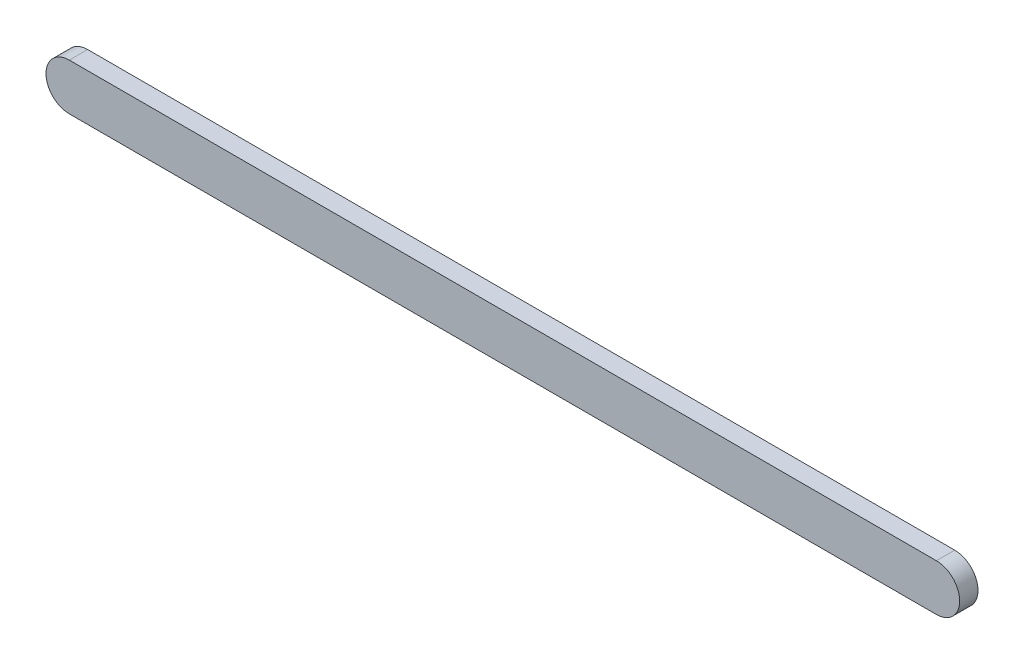
ISO-10303-21;
HEADER;
FILE_DESCRIPTION(('STEP AP214'),'2;1');
FILE_NAME('part.step','',(''),(''),'','','');
FILE_SCHEMA(('AUTOMOTIVE_DESIGN { 1 0 10303 214 1 1 1 1 }'));
ENDSEC;
DATA;
#1=APPLICATION_CONTEXT('core data for automotive mechanical design processes');
#2=APPLICATION_PROTOCOL_DEFINITION('international standard','automotive_design',2000,#1);
#3=PRODUCT_CONTEXT('',#1,'mechanical');
#4=PRODUCT('Part','Part','',(#3));
#5=PRODUCT_RELATED_PRODUCT_CATEGORY('part','',(#4));
#6=PRODUCT_DEFINITION_FORMATION('','',#4);
#7=PRODUCT_DEFINITION_CONTEXT('part definition',#1,'design');
#8=PRODUCT_DEFINITION('design','',#6,#7);
#9=PRODUCT_DEFINITION_SHAPE('','',#8);
#10=(LENGTH_UNIT() NAMED_UNIT(*) SI_UNIT(.MILLI.,.METRE.));
#11=(NAMED_UNIT(*) PLANE_ANGLE_UNIT() SI_UNIT($,.RADIAN.));
#12=(NAMED_UNIT(*) SI_UNIT($,.STERADIAN.) SOLID_ANGLE_UNIT());
#13=UNCERTAINTY_MEASURE_WITH_UNIT(LENGTH_MEASURE(1.E-05),#10,'distance_accuracy_value','');
#14=(GEOMETRIC_REPRESENTATION_CONTEXT(3) GLOBAL_UNCERTAINTY_ASSIGNED_CONTEXT((#13)) GLOBAL_UNIT_ASSIGNED_CONTEXT((#10,
#11,#12)) REPRESENTATION_CONTEXT('',''));
#15=CARTESIAN_POINT('',(0.,0.,0.));
#16=DIRECTION('',(0.,0.,1.));
#17=DIRECTION('',(1.,0.,0.));
#18=AXIS2_PLACEMENT_3D('',#15,#16,#17);
#19=CARTESIAN_POINT('',(139.641072,110.236,0.));
#20=DIRECTION('',(0.,1.,0.));
#21=DIRECTION('',(1.,0.,0.));
#22=AXIS2_PLACEMENT_3D('',#19,#20,#21);
#23=PLANE('',#22);
#24=DIRECTION('',(1.,0.,0.));
#25=VECTOR('',#24,1.);
#26=CARTESIAN_POINT('',(139.641072,110.236,0.1999996));
#27=LINE('',#26,#25);
#28=CARTESIAN_POINT('',(139.641072,110.236,0.1999996));
#29=VERTEX_POINT('',#28);
#30=CARTESIAN_POINT('',(149.098,110.236,0.1999996));
#31=VERTEX_POINT('',#30);
#32=EDGE_CURVE('E11',#29,#31,#27,.T.);
#33=ORIENTED_EDGE('',*,*,#32,.F.);
#34=DIRECTION('',(0.,0.,1.));
#35=VECTOR('',#34,1.);
#36=CARTESIAN_POINT('',(139.641072,110.236,0.));
#37=LINE('',#36,#35);
#38=CARTESIAN_POINT('',(139.641072,110.236,0.));
#39=VERTEX_POINT('',#38);
#40=EDGE_CURVE('E24',#39,#29,#37,.T.);
#41=ORIENTED_EDGE('',*,*,#40,.F.);
#42=DIRECTION('',(1.,0.,0.));
#43=VECTOR('',#42,1.);
#44=CARTESIAN_POINT('',(139.641072,110.236,0.));
#45=LINE('',#44,#43);
#46=CARTESIAN_POINT('',(149.098,110.236,0.));
#47=VERTEX_POINT('',#46);
#48=EDGE_CURVE('E75',#39,#47,#45,.T.);
#49=ORIENTED_EDGE('',*,*,#48,.T.);
#50=DIRECTION('',(0.,0.,1.));
#51=VECTOR('',#50,1.);
#52=CARTESIAN_POINT('',(149.098,110.236,0.));
#53=LINE('',#52,#51);
#54=EDGE_CURVE('E37',#47,#31,#53,.T.);
#55=ORIENTED_EDGE('',*,*,#54,.T.);
#56=EDGE_LOOP('',(#33,#41,#49,#55));
#57=FACE_BOUND('',#56,.T.);
#58=ADVANCED_FACE('F17',(#57),#23,.F.);
#59=CARTESIAN_POINT('',(149.098,110.49,0.));
#60=DIRECTION('',(0.,0.,-1.));
#61=DIRECTION('',(0.,-1.,0.));
#62=AXIS2_PLACEMENT_3D('',#59,#60,#61);
#63=CYLINDRICAL_SURFACE('',#62,0.253999999999995);
#64=CARTESIAN_POINT('',(149.098,110.49,0.1999996));
#65=DIRECTION('',(0.,0.,1.));
#66=DIRECTION('',(0.,-1.,0.));
#67=AXIS2_PLACEMENT_3D('',#64,#65,#66);
#68=CIRCLE('',#67,0.253999999999995);
#69=CARTESIAN_POINT('',(149.098,110.744,0.1999996));
#70=VERTEX_POINT('',#69);
#71=EDGE_CURVE('E83',#31,#70,#68,.T.);
#72=ORIENTED_EDGE('',*,*,#71,.F.);
#73=ORIENTED_EDGE('',*,*,#54,.F.);
#74=CARTESIAN_POINT('',(149.098,110.49,0.));
#75=DIRECTION('',(0.,0.,1.));
#76=DIRECTION('',(0.,-1.,0.));
#77=AXIS2_PLACEMENT_3D('',#74,#75,#76);
#78=CIRCLE('',#77,0.253999999999995);
#79=CARTESIAN_POINT('',(149.098,110.744,0.));
#80=VERTEX_POINT('',#79);
#81=EDGE_CURVE('E81',#47,#80,#78,.T.);
#82=ORIENTED_EDGE('',*,*,#81,.T.);
#83=DIRECTION('',(0.,0.,1.));
#84=VECTOR('',#83,1.);
#85=CARTESIAN_POINT('',(149.098,110.744,0.));
#86=LINE('',#85,#84);
#87=EDGE_CURVE('E67',#80,#70,#86,.T.);
#88=ORIENTED_EDGE('',*,*,#87,.T.);
#89=EDGE_LOOP('',(#72,#73,#82,#88));
#90=FACE_BOUND('',#89,.T.);
#91=ADVANCED_FACE('F89',(#90),#63,.T.);
#92=CARTESIAN_POINT('',(149.098,110.744,0.));
#93=DIRECTION('',(0.,-1.,0.));
#94=DIRECTION('',(-1.,0.,0.));
#95=AXIS2_PLACEMENT_3D('',#92,#93,#94);
#96=PLANE('',#95);
#97=DIRECTION('',(-1.,0.,0.));
#98=VECTOR('',#97,1.);
#99=CARTESIAN_POINT('',(149.098,110.744,0.1999996));
#100=LINE('',#99,#98);
#101=CARTESIAN_POINT('',(139.641072,110.744,0.1999996));
#102=VERTEX_POINT('',#101);
#103=EDGE_CURVE('E71',#70,#102,#100,.T.);
#104=ORIENTED_EDGE('',*,*,#103,.F.);
#105=ORIENTED_EDGE('',*,*,#87,.F.);
#106=DIRECTION('',(-1.,0.,0.));
#107=VECTOR('',#106,1.);
#108=CARTESIAN_POINT('',(149.098,110.744,0.));
#109=LINE('',#108,#107);
#110=CARTESIAN_POINT('',(139.641072,110.744,0.));
#111=VERTEX_POINT('',#110);
#112=EDGE_CURVE('E63',#80,#111,#109,.T.);
#113=ORIENTED_EDGE('',*,*,#112,.T.);
#114=DIRECTION('',(0.,0.,1.));
#115=VECTOR('',#114,1.);
#116=CARTESIAN_POINT('',(139.641072,110.744,0.));
#117=LINE('',#116,#115);
#118=EDGE_CURVE('E53',#111,#102,#117,.T.);
#119=ORIENTED_EDGE('',*,*,#118,.T.);
#120=EDGE_LOOP('',(#104,#105,#113,#119));
#121=FACE_BOUND('',#120,.T.);
#122=ADVANCED_FACE('F66',(#121),#96,.F.);
#123=CARTESIAN_POINT('',(139.641072,110.49,0.));
#124=DIRECTION('',(0.,0.,-1.));
#125=DIRECTION('',(1.11896493820486E-13,1.,0.));
#126=AXIS2_PLACEMENT_3D('',#123,#124,#125);
#127=CYLINDRICAL_SURFACE('',#126,0.253999999999995);
#128=CARTESIAN_POINT('',(139.641072,110.49,0.1999996));
#129=DIRECTION('',(0.,0.,1.));
#130=DIRECTION('',(1.11896493820486E-13,1.,0.));
#131=AXIS2_PLACEMENT_3D('',#128,#129,#130);
#132=CIRCLE('',#131,0.253999999999995);
#133=EDGE_CURVE('E59',#102,#29,#132,.T.);
#134=ORIENTED_EDGE('',*,*,#133,.F.);
#135=ORIENTED_EDGE('',*,*,#118,.F.);
#136=CARTESIAN_POINT('',(139.641072,110.49,0.));
#137=DIRECTION('',(0.,0.,1.));
#138=DIRECTION('',(1.11896493820486E-13,1.,0.));
#139=AXIS2_PLACEMENT_3D('',#136,#137,#138);
#140=CIRCLE('',#139,0.253999999999995);
#141=EDGE_CURVE('E57',#111,#39,#140,.T.);
#142=ORIENTED_EDGE('',*,*,#141,.T.);
#143=ORIENTED_EDGE('',*,*,#40,.T.);
#144=EDGE_LOOP('',(#134,#135,#142,#143));
#145=FACE_BOUND('',#144,.T.);
#146=ADVANCED_FACE('F55',(#145),#127,.T.);
#147=CARTESIAN_POINT('',(139.641072,110.236,0.));
#148=DIRECTION('',(0.,0.,-1.));
#149=DIRECTION('',(-1.,0.,0.));
#150=AXIS2_PLACEMENT_3D('',#147,#148,#149);
#151=PLANE('',#150);
#152=ORIENTED_EDGE('',*,*,#141,.F.);
#153=ORIENTED_EDGE('',*,*,#112,.F.);
#154=ORIENTED_EDGE('',*,*,#81,.F.);
#155=ORIENTED_EDGE('',*,*,#48,.F.);
#156=EDGE_LOOP('',(#152,#153,#154,#155));
#157=FACE_BOUND('',#156,.T.);
#158=ADVANCED_FACE('F74',(#157),#151,.T.);
#159=CARTESIAN_POINT('',(139.641072,110.236,0.1999996));
#160=DIRECTION('',(0.,0.,-1.));
#161=DIRECTION('',(-1.,0.,0.));
#162=AXIS2_PLACEMENT_3D('',#159,#160,#161);
#163=PLANE('',#162);
#164=ORIENTED_EDGE('',*,*,#32,.T.);
#165=ORIENTED_EDGE('',*,*,#71,.T.);
#166=ORIENTED_EDGE('',*,*,#103,.T.);
#167=ORIENTED_EDGE('',*,*,#133,.T.);
#168=EDGE_LOOP('',(#164,#165,#166,#167));
#169=FACE_BOUND('',#168,.T.);
#170=ADVANCED_FACE('F91',(#169),#163,.F.);
#171=CLOSED_SHELL('',(#58,#91,#122,#146,#158,#170));
#172=MANIFOLD_SOLID_BREP('B1',#171);
#173=ADVANCED_BREP_SHAPE_REPRESENTATION('',(#18,#172),#14);
#174=SHAPE_DEFINITION_REPRESENTATION(#9,#173);
ENDSEC;
END-ISO-10303-21;
